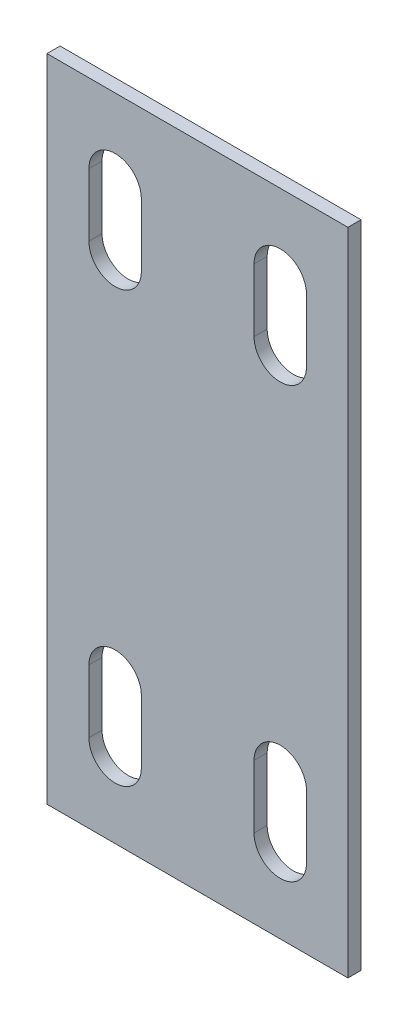
ISO-10303-21;
HEADER;
FILE_DESCRIPTION(('STEP AP214'),'2;1');
FILE_NAME('part.step','',(''),(''),'','','');
FILE_SCHEMA(('AUTOMOTIVE_DESIGN { 1 0 10303 214 1 1 1 1 }'));
ENDSEC;
DATA;
#1=APPLICATION_CONTEXT('core data for automotive mechanical design processes');
#2=APPLICATION_PROTOCOL_DEFINITION('international standard','automotive_design',2000,#1);
#3=PRODUCT_CONTEXT('',#1,'mechanical');
#4=PRODUCT('Part','Part','',(#3));
#5=PRODUCT_RELATED_PRODUCT_CATEGORY('part','',(#4));
#6=PRODUCT_DEFINITION_FORMATION('','',#4);
#7=PRODUCT_DEFINITION_CONTEXT('part definition',#1,'design');
#8=PRODUCT_DEFINITION('design','',#6,#7);
#9=PRODUCT_DEFINITION_SHAPE('','',#8);
#10=(LENGTH_UNIT() NAMED_UNIT(*) SI_UNIT(.MILLI.,.METRE.));
#11=(NAMED_UNIT(*) PLANE_ANGLE_UNIT() SI_UNIT($,.RADIAN.));
#12=(NAMED_UNIT(*) SI_UNIT($,.STERADIAN.) SOLID_ANGLE_UNIT());
#13=UNCERTAINTY_MEASURE_WITH_UNIT(LENGTH_MEASURE(1.E-05),#10,'distance_accuracy_value','');
#14=(GEOMETRIC_REPRESENTATION_CONTEXT(3) GLOBAL_UNCERTAINTY_ASSIGNED_CONTEXT((#13)) GLOBAL_UNIT_ASSIGNED_CONTEXT((#10,
#11,#12)) REPRESENTATION_CONTEXT('',''));
#15=CARTESIAN_POINT('',(0.,0.,0.));
#16=DIRECTION('',(0.,0.,1.));
#17=DIRECTION('',(1.,0.,0.));
#18=AXIS2_PLACEMENT_3D('',#15,#16,#17);
#19=CARTESIAN_POINT('',(-101.381085315594,81.3749480536358,3.175));
#20=DIRECTION('',(1.,0.,0.));
#21=DIRECTION('',(0.,1.,0.));
#22=AXIS2_PLACEMENT_3D('',#19,#20,#21);
#23=PLANE('',#22);
#24=DIRECTION('',(0.,-1.,0.));
#25=VECTOR('',#24,1.);
#26=CARTESIAN_POINT('',(-101.381085315594,81.3749480536358,0.));
#27=LINE('',#26,#25);
#28=CARTESIAN_POINT('',(-101.381085315594,81.3749480536358,0.));
#29=VERTEX_POINT('',#28);
#30=CARTESIAN_POINT('',(-101.381085315594,-76.1050519463642,0.));
#31=VERTEX_POINT('',#30);
#32=EDGE_CURVE('E350',#29,#31,#27,.T.);
#33=ORIENTED_EDGE('',*,*,#32,.T.);
#34=DIRECTION('',(0.,0.,-1.));
#35=VECTOR('',#34,1.);
#36=CARTESIAN_POINT('',(-101.381085315594,-76.1050519463642,3.175));
#37=LINE('',#36,#35);
#38=CARTESIAN_POINT('',(-101.381085315594,-76.1050519463642,3.175));
#39=VERTEX_POINT('',#38);
#40=EDGE_CURVE('E11',#39,#31,#37,.T.);
#41=ORIENTED_EDGE('',*,*,#40,.F.);
#42=DIRECTION('',(0.,-1.,0.));
#43=VECTOR('',#42,1.);
#44=CARTESIAN_POINT('',(-101.381085315594,81.3749480536358,3.175));
#45=LINE('',#44,#43);
#46=CARTESIAN_POINT('',(-101.381085315594,81.3749480536358,3.175));
#47=VERTEX_POINT('',#46);
#48=EDGE_CURVE('E360',#47,#39,#45,.T.);
#49=ORIENTED_EDGE('',*,*,#48,.F.);
#50=DIRECTION('',(0.,0.,-1.));
#51=VECTOR('',#50,1.);
#52=CARTESIAN_POINT('',(-101.381085315594,81.3749480536358,3.175));
#53=LINE('',#52,#51);
#54=EDGE_CURVE('E374',#47,#29,#53,.T.);
#55=ORIENTED_EDGE('',*,*,#54,.T.);
#56=EDGE_LOOP('',(#33,#41,#49,#55));
#57=FACE_BOUND('',#56,.T.);
#58=ADVANCED_FACE('F39',(#57),#23,.F.);
#59=CARTESIAN_POINT('',(-101.381085315594,-76.1050519463642,3.175));
#60=DIRECTION('',(0.,1.,0.));
#61=DIRECTION('',(0.,0.,1.));
#62=AXIS2_PLACEMENT_3D('',#59,#60,#61);
#63=PLANE('',#62);
#64=DIRECTION('',(1.,0.,0.));
#65=VECTOR('',#64,1.);
#66=CARTESIAN_POINT('',(-101.381085315594,-76.1050519463642,0.));
#67=LINE('',#66,#65);
#68=CARTESIAN_POINT('',(-28.4830853155941,-76.1050519463642,0.));
#69=VERTEX_POINT('',#68);
#70=EDGE_CURVE('E378',#31,#69,#67,.T.);
#71=ORIENTED_EDGE('',*,*,#70,.T.);
#72=DIRECTION('',(0.,0.,-1.));
#73=VECTOR('',#72,1.);
#74=CARTESIAN_POINT('',(-28.4830853155941,-76.1050519463642,3.175));
#75=LINE('',#74,#73);
#76=CARTESIAN_POINT('',(-28.4830853155941,-76.1050519463642,3.175));
#77=VERTEX_POINT('',#76);
#78=EDGE_CURVE('E47',#77,#69,#75,.T.);
#79=ORIENTED_EDGE('',*,*,#78,.F.);
#80=DIRECTION('',(1.,0.,0.));
#81=VECTOR('',#80,1.);
#82=CARTESIAN_POINT('',(-101.381085315594,-76.1050519463642,3.175));
#83=LINE('',#82,#81);
#84=EDGE_CURVE('E364',#39,#77,#83,.T.);
#85=ORIENTED_EDGE('',*,*,#84,.F.);
#86=ORIENTED_EDGE('',*,*,#40,.T.);
#87=EDGE_LOOP('',(#71,#79,#85,#86));
#88=FACE_BOUND('',#87,.T.);
#89=ADVANCED_FACE('F413',(#88),#63,.F.);
#90=CARTESIAN_POINT('',(-28.4830853155941,81.3749480536358,3.175));
#91=DIRECTION('',(-1.,0.,0.));
#92=DIRECTION('',(0.,-1.,0.));
#93=AXIS2_PLACEMENT_3D('',#90,#91,#92);
#94=PLANE('',#93);
#95=DIRECTION('',(0.,1.,0.));
#96=VECTOR('',#95,1.);
#97=CARTESIAN_POINT('',(-28.4830853155941,81.3749480536358,0.));
#98=LINE('',#97,#96);
#99=CARTESIAN_POINT('',(-28.4830853155941,81.3749480536358,0.));
#100=VERTEX_POINT('',#99);
#101=EDGE_CURVE('E381',#69,#100,#98,.T.);
#102=ORIENTED_EDGE('',*,*,#101,.T.);
#103=DIRECTION('',(0.,0.,-1.));
#104=VECTOR('',#103,1.);
#105=CARTESIAN_POINT('',(-28.4830853155941,81.3749480536358,3.175));
#106=LINE('',#105,#104);
#107=CARTESIAN_POINT('',(-28.4830853155941,81.3749480536358,3.175));
#108=VERTEX_POINT('',#107);
#109=EDGE_CURVE('E389',#108,#100,#106,.T.);
#110=ORIENTED_EDGE('',*,*,#109,.F.);
#111=DIRECTION('',(0.,1.,0.));
#112=VECTOR('',#111,1.);
#113=CARTESIAN_POINT('',(-28.4830853155941,81.3749480536358,3.175));
#114=LINE('',#113,#112);
#115=EDGE_CURVE('E368',#77,#108,#114,.T.);
#116=ORIENTED_EDGE('',*,*,#115,.F.);
#117=ORIENTED_EDGE('',*,*,#78,.T.);
#118=EDGE_LOOP('',(#102,#110,#116,#117));
#119=FACE_BOUND('',#118,.T.);
#120=ADVANCED_FACE('F398',(#119),#94,.F.);
#121=CARTESIAN_POINT('',(-101.381085315594,81.3749480536358,3.175));
#122=DIRECTION('',(0.,-1.,0.));
#123=DIRECTION('',(0.,0.,-1.));
#124=AXIS2_PLACEMENT_3D('',#121,#122,#123);
#125=PLANE('',#124);
#126=DIRECTION('',(-1.,0.,0.));
#127=VECTOR('',#126,1.);
#128=CARTESIAN_POINT('',(-101.381085315594,81.3749480536358,0.));
#129=LINE('',#128,#127);
#130=EDGE_CURVE('E365',#100,#29,#129,.T.);
#131=ORIENTED_EDGE('',*,*,#130,.T.);
#132=ORIENTED_EDGE('',*,*,#54,.F.);
#133=DIRECTION('',(-1.,0.,0.));
#134=VECTOR('',#133,1.);
#135=CARTESIAN_POINT('',(-101.381085315594,81.3749480536358,3.175));
#136=LINE('',#135,#134);
#137=EDGE_CURVE('E371',#108,#47,#136,.T.);
#138=ORIENTED_EDGE('',*,*,#137,.F.);
#139=ORIENTED_EDGE('',*,*,#109,.T.);
#140=EDGE_LOOP('',(#131,#132,#138,#139));
#141=FACE_BOUND('',#140,.T.);
#142=ADVANCED_FACE('F406',(#141),#125,.F.);
#143=CARTESIAN_POINT('',(0.,0.,3.175));
#144=DIRECTION('',(0.,0.,1.));
#145=DIRECTION('',(1.,0.,0.));
#146=AXIS2_PLACEMENT_3D('',#143,#144,#145);
#147=PLANE('',#146);
#148=CARTESIAN_POINT('',(-44.8711656839901,62.3249484220318,3.175));
#149=DIRECTION('',(0.,0.,1.));
#150=DIRECTION('',(1.,0.,0.));
#151=AXIS2_PLACEMENT_3D('',#148,#149,#150);
#152=CIRCLE('',#151,6.349999631604);
#153=CARTESIAN_POINT('',(-38.5211660523861,62.3249484220318,3.175));
#154=VERTEX_POINT('',#153);
#155=CARTESIAN_POINT('',(-51.2211653155941,62.3249484220318,3.175));
#156=VERTEX_POINT('',#155);
#157=EDGE_CURVE('E54',#154,#156,#152,.T.);
#158=ORIENTED_EDGE('',*,*,#157,.F.);
#159=DIRECTION('',(0.,1.,0.));
#160=VECTOR('',#159,1.);
#161=CARTESIAN_POINT('',(-38.5211660523861,62.3249484220318,3.175));
#162=LINE('',#161,#160);
#163=CARTESIAN_POINT('',(-38.5211660523861,47.0849480536358,3.175));
#164=VERTEX_POINT('',#163);
#165=EDGE_CURVE('E280',#164,#154,#162,.T.);
#166=ORIENTED_EDGE('',*,*,#165,.F.);
#167=CARTESIAN_POINT('',(-44.8711656839901,47.0849480536358,3.175));
#168=DIRECTION('',(0.,0.,1.));
#169=DIRECTION('',(1.,0.,0.));
#170=AXIS2_PLACEMENT_3D('',#167,#168,#169);
#171=CIRCLE('',#170,6.349999631604);
#172=CARTESIAN_POINT('',(-51.2211653155941,47.0849480536358,3.175));
#173=VERTEX_POINT('',#172);
#174=EDGE_CURVE('E299',#173,#164,#171,.T.);
#175=ORIENTED_EDGE('',*,*,#174,.F.);
#176=DIRECTION('',(0.,-1.,0.));
#177=VECTOR('',#176,1.);
#178=CARTESIAN_POINT('',(-51.2211653155941,62.3249484220318,3.175));
#179=LINE('',#178,#177);
#180=EDGE_CURVE('E295',#156,#173,#179,.T.);
#181=ORIENTED_EDGE('',*,*,#180,.F.);
#182=EDGE_LOOP('',(#158,#166,#175,#181));
#183=FACE_BOUND('',#182,.T.);
#184=CARTESIAN_POINT('',(-84.8710856839901,-41.8150512095722,3.175));
#185=DIRECTION('',(0.,0.,1.));
#186=DIRECTION('',(1.,0.,0.));
#187=AXIS2_PLACEMENT_3D('',#184,#185,#186);
#188=CIRCLE('',#187,6.349999631604);
#189=CARTESIAN_POINT('',(-78.5210860523861,-41.8150512095722,3.175));
#190=VERTEX_POINT('',#189);
#191=CARTESIAN_POINT('',(-91.2210853155941,-41.8150512095722,3.175));
#192=VERTEX_POINT('',#191);
#193=EDGE_CURVE('E62',#190,#192,#188,.T.);
#194=ORIENTED_EDGE('',*,*,#193,.F.);
#195=DIRECTION('',(0.,1.,0.));
#196=VECTOR('',#195,1.);
#197=CARTESIAN_POINT('',(-78.5210860523861,-41.8150512095722,3.175));
#198=LINE('',#197,#196);
#199=CARTESIAN_POINT('',(-78.5210860523861,-57.0550515779682,3.175));
#200=VERTEX_POINT('',#199);
#201=EDGE_CURVE('E238',#200,#190,#198,.T.);
#202=ORIENTED_EDGE('',*,*,#201,.F.);
#203=CARTESIAN_POINT('',(-84.8710856839901,-57.0550515779682,3.175));
#204=DIRECTION('',(0.,0.,1.));
#205=DIRECTION('',(1.,0.,0.));
#206=AXIS2_PLACEMENT_3D('',#203,#204,#205);
#207=CIRCLE('',#206,6.349999631604);
#208=CARTESIAN_POINT('',(-91.2210853155941,-57.0550515779682,3.175));
#209=VERTEX_POINT('',#208);
#210=EDGE_CURVE('E258',#209,#200,#207,.T.);
#211=ORIENTED_EDGE('',*,*,#210,.F.);
#212=DIRECTION('',(0.,-1.,0.));
#213=VECTOR('',#212,1.);
#214=CARTESIAN_POINT('',(-91.2210853155941,-41.8150512095722,3.175));
#215=LINE('',#214,#213);
#216=EDGE_CURVE('E253',#192,#209,#215,.T.);
#217=ORIENTED_EDGE('',*,*,#216,.F.);
#218=EDGE_LOOP('',(#194,#202,#211,#217));
#219=FACE_BOUND('',#218,.T.);
#220=CARTESIAN_POINT('',(-44.8711656839901,-57.0550515779682,3.175));
#221=DIRECTION('',(0.,0.,1.));
#222=DIRECTION('',(1.,0.,0.));
#223=AXIS2_PLACEMENT_3D('',#220,#221,#222);
#224=CIRCLE('',#223,6.34999963160401);
#225=CARTESIAN_POINT('',(-51.2211653155941,-57.0550515779682,3.175));
#226=VERTEX_POINT('',#225);
#227=CARTESIAN_POINT('',(-38.5211660523861,-57.0550515779682,3.175));
#228=VERTEX_POINT('',#227);
#229=EDGE_CURVE('E183',#226,#228,#224,.T.);
#230=ORIENTED_EDGE('',*,*,#229,.F.);
#231=DIRECTION('',(0.,-1.,0.));
#232=VECTOR('',#231,1.);
#233=CARTESIAN_POINT('',(-51.2211653155941,-57.0550515779682,3.175));
#234=LINE('',#233,#232);
#235=CARTESIAN_POINT('',(-51.2211653155941,-41.8150512095722,3.175));
#236=VERTEX_POINT('',#235);
#237=EDGE_CURVE('E204',#236,#226,#234,.T.);
#238=ORIENTED_EDGE('',*,*,#237,.F.);
#239=CARTESIAN_POINT('',(-44.8711656839901,-41.8150512095722,3.175));
#240=DIRECTION('',(0.,0.,1.));
#241=DIRECTION('',(1.,0.,0.));
#242=AXIS2_PLACEMENT_3D('',#239,#240,#241);
#243=CIRCLE('',#242,6.34999963160399);
#244=CARTESIAN_POINT('',(-38.5211660523861,-41.8150512095722,3.175));
#245=VERTEX_POINT('',#244);
#246=EDGE_CURVE('E208',#245,#236,#243,.T.);
#247=ORIENTED_EDGE('',*,*,#246,.F.);
#248=DIRECTION('',(0.,1.,0.));
#249=VECTOR('',#248,1.);
#250=CARTESIAN_POINT('',(-38.5211660523861,-57.0550515779682,3.175));
#251=LINE('',#250,#249);
#252=EDGE_CURVE('E217',#228,#245,#251,.T.);
#253=ORIENTED_EDGE('',*,*,#252,.F.);
#254=EDGE_LOOP('',(#230,#238,#247,#253));
#255=FACE_BOUND('',#254,.T.);
#256=CARTESIAN_POINT('',(-84.8710856839901,47.0849480536358,3.175));
#257=DIRECTION('',(0.,0.,1.));
#258=DIRECTION('',(1.,0.,0.));
#259=AXIS2_PLACEMENT_3D('',#256,#257,#258);
#260=CIRCLE('',#259,6.349999631604);
#261=CARTESIAN_POINT('',(-91.2210853155941,47.0849480536358,3.175));
#262=VERTEX_POINT('',#261);
#263=CARTESIAN_POINT('',(-78.5210860523861,47.0849480536358,3.175));
#264=VERTEX_POINT('',#263);
#265=EDGE_CURVE('E227',#262,#264,#260,.T.);
#266=ORIENTED_EDGE('',*,*,#265,.F.);
#267=DIRECTION('',(0.,-1.,0.));
#268=VECTOR('',#267,1.);
#269=CARTESIAN_POINT('',(-91.2210853155941,47.0849480536358,3.175));
#270=LINE('',#269,#268);
#271=CARTESIAN_POINT('',(-91.2210853155941,62.3249484220318,3.175));
#272=VERTEX_POINT('',#271);
#273=EDGE_CURVE('E321',#272,#262,#270,.T.);
#274=ORIENTED_EDGE('',*,*,#273,.F.);
#275=CARTESIAN_POINT('',(-84.8710856839901,62.3249484220318,3.175));
#276=DIRECTION('',(0.,0.,1.));
#277=DIRECTION('',(1.,0.,0.));
#278=AXIS2_PLACEMENT_3D('',#275,#276,#277);
#279=CIRCLE('',#278,6.349999631604);
#280=CARTESIAN_POINT('',(-78.5210860523861,62.3249484220318,3.175));
#281=VERTEX_POINT('',#280);
#282=EDGE_CURVE('E340',#281,#272,#279,.T.);
#283=ORIENTED_EDGE('',*,*,#282,.F.);
#284=DIRECTION('',(0.,1.,0.));
#285=VECTOR('',#284,1.);
#286=CARTESIAN_POINT('',(-78.5210860523861,47.0849480536358,3.175));
#287=LINE('',#286,#285);
#288=EDGE_CURVE('E336',#264,#281,#287,.T.);
#289=ORIENTED_EDGE('',*,*,#288,.F.);
#290=EDGE_LOOP('',(#266,#274,#283,#289));
#291=FACE_BOUND('',#290,.T.);
#292=ORIENTED_EDGE('',*,*,#48,.T.);
#293=ORIENTED_EDGE('',*,*,#84,.T.);
#294=ORIENTED_EDGE('',*,*,#115,.T.);
#295=ORIENTED_EDGE('',*,*,#137,.T.);
#296=EDGE_LOOP('',(#292,#293,#294,#295));
#297=FACE_BOUND('',#296,.T.);
#298=ADVANCED_FACE('F412',(#183,#219,#255,#291,#297),#147,.T.);
#299=CARTESIAN_POINT('',(0.,0.,0.));
#300=DIRECTION('',(0.,0.,1.));
#301=DIRECTION('',(1.,0.,0.));
#302=AXIS2_PLACEMENT_3D('',#299,#300,#301);
#303=PLANE('',#302);
#304=DIRECTION('',(0.,1.,0.));
#305=VECTOR('',#304,1.);
#306=CARTESIAN_POINT('',(-38.5211660523861,62.3249484220318,0.));
#307=LINE('',#306,#305);
#308=CARTESIAN_POINT('',(-38.5211660523861,47.0849480536358,0.));
#309=VERTEX_POINT('',#308);
#310=CARTESIAN_POINT('',(-38.5211660523861,62.3249484220318,0.));
#311=VERTEX_POINT('',#310);
#312=EDGE_CURVE('E288',#309,#311,#307,.T.);
#313=ORIENTED_EDGE('',*,*,#312,.T.);
#314=CARTESIAN_POINT('',(-44.8711656839901,62.3249484220318,0.));
#315=DIRECTION('',(0.,0.,1.));
#316=DIRECTION('',(1.,0.,0.));
#317=AXIS2_PLACEMENT_3D('',#314,#315,#316);
#318=CIRCLE('',#317,6.349999631604);
#319=CARTESIAN_POINT('',(-51.2211653155941,62.3249484220318,0.));
#320=VERTEX_POINT('',#319);
#321=EDGE_CURVE('E275',#311,#320,#318,.T.);
#322=ORIENTED_EDGE('',*,*,#321,.T.);
#323=DIRECTION('',(0.,-1.,0.));
#324=VECTOR('',#323,1.);
#325=CARTESIAN_POINT('',(-51.2211653155941,62.3249484220318,0.));
#326=LINE('',#325,#324);
#327=CARTESIAN_POINT('',(-51.2211653155941,47.0849480536358,0.));
#328=VERTEX_POINT('',#327);
#329=EDGE_CURVE('E279',#320,#328,#326,.T.);
#330=ORIENTED_EDGE('',*,*,#329,.T.);
#331=CARTESIAN_POINT('',(-44.8711656839901,47.0849480536358,0.));
#332=DIRECTION('',(0.,0.,1.));
#333=DIRECTION('',(1.,0.,0.));
#334=AXIS2_PLACEMENT_3D('',#331,#332,#333);
#335=CIRCLE('',#334,6.349999631604);
#336=EDGE_CURVE('E284',#328,#309,#335,.T.);
#337=ORIENTED_EDGE('',*,*,#336,.T.);
#338=EDGE_LOOP('',(#313,#322,#330,#337));
#339=FACE_BOUND('',#338,.T.);
#340=DIRECTION('',(0.,1.,0.));
#341=VECTOR('',#340,1.);
#342=CARTESIAN_POINT('',(-78.5210860523861,-41.8150512095722,0.));
#343=LINE('',#342,#341);
#344=CARTESIAN_POINT('',(-78.5210860523861,-57.0550515779682,0.));
#345=VERTEX_POINT('',#344);
#346=CARTESIAN_POINT('',(-78.5210860523861,-41.8150512095722,0.));
#347=VERTEX_POINT('',#346);
#348=EDGE_CURVE('E246',#345,#347,#343,.T.);
#349=ORIENTED_EDGE('',*,*,#348,.T.);
#350=CARTESIAN_POINT('',(-84.8710856839901,-41.8150512095722,0.));
#351=DIRECTION('',(0.,0.,1.));
#352=DIRECTION('',(1.,0.,0.));
#353=AXIS2_PLACEMENT_3D('',#350,#351,#352);
#354=CIRCLE('',#353,6.349999631604);
#355=CARTESIAN_POINT('',(-91.2210853155941,-41.8150512095722,0.));
#356=VERTEX_POINT('',#355);
#357=EDGE_CURVE('E233',#347,#356,#354,.T.);
#358=ORIENTED_EDGE('',*,*,#357,.T.);
#359=DIRECTION('',(0.,-1.,0.));
#360=VECTOR('',#359,1.);
#361=CARTESIAN_POINT('',(-91.2210853155941,-41.8150512095722,0.));
#362=LINE('',#361,#360);
#363=CARTESIAN_POINT('',(-91.2210853155941,-57.0550515779682,0.));
#364=VERTEX_POINT('',#363);
#365=EDGE_CURVE('E237',#356,#364,#362,.T.);
#366=ORIENTED_EDGE('',*,*,#365,.T.);
#367=CARTESIAN_POINT('',(-84.8710856839901,-57.0550515779682,0.));
#368=DIRECTION('',(0.,0.,1.));
#369=DIRECTION('',(1.,0.,0.));
#370=AXIS2_PLACEMENT_3D('',#367,#368,#369);
#371=CIRCLE('',#370,6.349999631604);
#372=EDGE_CURVE('E242',#364,#345,#371,.T.);
#373=ORIENTED_EDGE('',*,*,#372,.T.);
#374=EDGE_LOOP('',(#349,#358,#366,#373));
#375=FACE_BOUND('',#374,.T.);
#376=DIRECTION('',(0.,-1.,0.));
#377=VECTOR('',#376,1.);
#378=CARTESIAN_POINT('',(-51.2211653155941,-57.0550515779682,0.));
#379=LINE('',#378,#377);
#380=CARTESIAN_POINT('',(-51.2211653155941,-41.8150512095722,0.));
#381=VERTEX_POINT('',#380);
#382=CARTESIAN_POINT('',(-51.2211653155941,-57.0550515779682,0.));
#383=VERTEX_POINT('',#382);
#384=EDGE_CURVE('E189',#381,#383,#379,.T.);
#385=ORIENTED_EDGE('',*,*,#384,.T.);
#386=CARTESIAN_POINT('',(-44.8711656839901,-57.0550515779682,0.));
#387=DIRECTION('',(0.,0.,1.));
#388=DIRECTION('',(1.,0.,0.));
#389=AXIS2_PLACEMENT_3D('',#386,#387,#388);
#390=CIRCLE('',#389,6.34999963160401);
#391=CARTESIAN_POINT('',(-38.5211660523861,-57.0550515779682,0.));
#392=VERTEX_POINT('',#391);
#393=EDGE_CURVE('E180',#383,#392,#390,.T.);
#394=ORIENTED_EDGE('',*,*,#393,.T.);
#395=DIRECTION('',(0.,1.,0.));
#396=VECTOR('',#395,1.);
#397=CARTESIAN_POINT('',(-38.5211660523861,-57.0550515779682,0.));
#398=LINE('',#397,#396);
#399=CARTESIAN_POINT('',(-38.5211660523861,-41.8150512095722,0.));
#400=VERTEX_POINT('',#399);
#401=EDGE_CURVE('E193',#392,#400,#398,.T.);
#402=ORIENTED_EDGE('',*,*,#401,.T.);
#403=CARTESIAN_POINT('',(-44.8711656839901,-41.8150512095722,0.));
#404=DIRECTION('',(0.,0.,1.));
#405=DIRECTION('',(1.,0.,0.));
#406=AXIS2_PLACEMENT_3D('',#403,#404,#405);
#407=CIRCLE('',#406,6.34999963160399);
#408=EDGE_CURVE('E198',#400,#381,#407,.T.);
#409=ORIENTED_EDGE('',*,*,#408,.T.);
#410=EDGE_LOOP('',(#385,#394,#402,#409));
#411=FACE_BOUND('',#410,.T.);
#412=DIRECTION('',(0.,-1.,0.));
#413=VECTOR('',#412,1.);
#414=CARTESIAN_POINT('',(-91.2210853155941,47.0849480536358,0.));
#415=LINE('',#414,#413);
#416=CARTESIAN_POINT('',(-91.2210853155941,62.3249484220318,0.));
#417=VERTEX_POINT('',#416);
#418=CARTESIAN_POINT('',(-91.2210853155941,47.0849480536358,0.));
#419=VERTEX_POINT('',#418);
#420=EDGE_CURVE('E329',#417,#419,#415,.T.);
#421=ORIENTED_EDGE('',*,*,#420,.T.);
#422=CARTESIAN_POINT('',(-84.8710856839901,47.0849480536358,0.));
#423=DIRECTION('',(0.,0.,1.));
#424=DIRECTION('',(1.,0.,0.));
#425=AXIS2_PLACEMENT_3D('',#422,#423,#424);
#426=CIRCLE('',#425,6.349999631604);
#427=CARTESIAN_POINT('',(-78.5210860523861,47.0849480536358,0.));
#428=VERTEX_POINT('',#427);
#429=EDGE_CURVE('E316',#419,#428,#426,.T.);
#430=ORIENTED_EDGE('',*,*,#429,.T.);
#431=DIRECTION('',(0.,1.,0.));
#432=VECTOR('',#431,1.);
#433=CARTESIAN_POINT('',(-78.5210860523861,47.0849480536358,0.));
#434=LINE('',#433,#432);
#435=CARTESIAN_POINT('',(-78.5210860523861,62.3249484220318,0.));
#436=VERTEX_POINT('',#435);
#437=EDGE_CURVE('E320',#428,#436,#434,.T.);
#438=ORIENTED_EDGE('',*,*,#437,.T.);
#439=CARTESIAN_POINT('',(-84.8710856839901,62.3249484220318,0.));
#440=DIRECTION('',(0.,0.,1.));
#441=DIRECTION('',(1.,0.,0.));
#442=AXIS2_PLACEMENT_3D('',#439,#440,#441);
#443=CIRCLE('',#442,6.349999631604);
#444=EDGE_CURVE('E325',#436,#417,#443,.T.);
#445=ORIENTED_EDGE('',*,*,#444,.T.);
#446=EDGE_LOOP('',(#421,#430,#438,#445));
#447=FACE_BOUND('',#446,.T.);
#448=ORIENTED_EDGE('',*,*,#32,.F.);
#449=ORIENTED_EDGE('',*,*,#130,.F.);
#450=ORIENTED_EDGE('',*,*,#101,.F.);
#451=ORIENTED_EDGE('',*,*,#70,.F.);
#452=EDGE_LOOP('',(#448,#449,#450,#451));
#453=FACE_BOUND('',#452,.T.);
#454=ADVANCED_FACE('F200',(#339,#375,#411,#447,#453),#303,.F.);
#455=CARTESIAN_POINT('',(-84.8710856839901,47.0849480536358,0.));
#456=DIRECTION('',(0.,0.,1.));
#457=DIRECTION('',(1.,0.,0.));
#458=AXIS2_PLACEMENT_3D('',#455,#456,#457);
#459=CYLINDRICAL_SURFACE('',#458,6.349999631604);
#460=ORIENTED_EDGE('',*,*,#265,.T.);
#461=DIRECTION('',(0.,0.,1.));
#462=VECTOR('',#461,1.);
#463=CARTESIAN_POINT('',(-78.5210860523861,47.0849480536358,0.));
#464=LINE('',#463,#462);
#465=EDGE_CURVE('E333',#428,#264,#464,.T.);
#466=ORIENTED_EDGE('',*,*,#465,.F.);
#467=ORIENTED_EDGE('',*,*,#429,.F.);
#468=DIRECTION('',(0.,0.,1.));
#469=VECTOR('',#468,1.);
#470=CARTESIAN_POINT('',(-91.2210853155941,47.0849480536358,0.));
#471=LINE('',#470,#469);
#472=EDGE_CURVE('E347',#419,#262,#471,.T.);
#473=ORIENTED_EDGE('',*,*,#472,.T.);
#474=EDGE_LOOP('',(#460,#466,#467,#473));
#475=FACE_BOUND('',#474,.T.);
#476=ADVANCED_FACE('F425',(#475),#459,.F.);
#477=CARTESIAN_POINT('',(-91.2210853155941,47.0849480536358,0.));
#478=DIRECTION('',(-1.,0.,0.));
#479=DIRECTION('',(0.,0.,1.));
#480=AXIS2_PLACEMENT_3D('',#477,#478,#479);
#481=PLANE('',#480);
#482=ORIENTED_EDGE('',*,*,#273,.T.);
#483=ORIENTED_EDGE('',*,*,#472,.F.);
#484=ORIENTED_EDGE('',*,*,#420,.F.);
#485=DIRECTION('',(0.,0.,1.));
#486=VECTOR('',#485,1.);
#487=CARTESIAN_POINT('',(-91.2210853155941,62.3249484220318,0.));
#488=LINE('',#487,#486);
#489=EDGE_CURVE('E351',#417,#272,#488,.T.);
#490=ORIENTED_EDGE('',*,*,#489,.T.);
#491=EDGE_LOOP('',(#482,#483,#484,#490));
#492=FACE_BOUND('',#491,.T.);
#493=ADVANCED_FACE('F432',(#492),#481,.F.);
#494=CARTESIAN_POINT('',(-84.8710856839901,62.3249484220318,0.));
#495=DIRECTION('',(0.,0.,1.));
#496=DIRECTION('',(1.,0.,0.));
#497=AXIS2_PLACEMENT_3D('',#494,#495,#496);
#498=CYLINDRICAL_SURFACE('',#497,6.349999631604);
#499=ORIENTED_EDGE('',*,*,#282,.T.);
#500=ORIENTED_EDGE('',*,*,#489,.F.);
#501=ORIENTED_EDGE('',*,*,#444,.F.);
#502=DIRECTION('',(0.,0.,1.));
#503=VECTOR('',#502,1.);
#504=CARTESIAN_POINT('',(-78.5210860523861,62.3249484220318,0.));
#505=LINE('',#504,#503);
#506=EDGE_CURVE('E354',#436,#281,#505,.T.);
#507=ORIENTED_EDGE('',*,*,#506,.T.);
#508=EDGE_LOOP('',(#499,#500,#501,#507));
#509=FACE_BOUND('',#508,.T.);
#510=ADVANCED_FACE('F437',(#509),#498,.F.);
#511=CARTESIAN_POINT('',(-78.5210860523861,47.0849480536358,0.));
#512=DIRECTION('',(1.,0.,0.));
#513=DIRECTION('',(0.,0.,-1.));
#514=AXIS2_PLACEMENT_3D('',#511,#512,#513);
#515=PLANE('',#514);
#516=ORIENTED_EDGE('',*,*,#288,.T.);
#517=ORIENTED_EDGE('',*,*,#506,.F.);
#518=ORIENTED_EDGE('',*,*,#437,.F.);
#519=ORIENTED_EDGE('',*,*,#465,.T.);
#520=EDGE_LOOP('',(#516,#517,#518,#519));
#521=FACE_BOUND('',#520,.T.);
#522=ADVANCED_FACE('F434',(#521),#515,.F.);
#523=CARTESIAN_POINT('',(-44.8711656839901,-57.0550515779682,0.));
#524=DIRECTION('',(0.,0.,1.));
#525=DIRECTION('',(1.,0.,0.));
#526=AXIS2_PLACEMENT_3D('',#523,#524,#525);
#527=CYLINDRICAL_SURFACE('',#526,6.34999963160401);
#528=ORIENTED_EDGE('',*,*,#229,.T.);
#529=DIRECTION('',(0.,0.,1.));
#530=VECTOR('',#529,1.);
#531=CARTESIAN_POINT('',(-38.5211660523861,-57.0550515779682,0.));
#532=LINE('',#531,#530);
#533=EDGE_CURVE('E176',#392,#228,#532,.T.);
#534=ORIENTED_EDGE('',*,*,#533,.F.);
#535=ORIENTED_EDGE('',*,*,#393,.F.);
#536=DIRECTION('',(0.,0.,1.));
#537=VECTOR('',#536,1.);
#538=CARTESIAN_POINT('',(-51.2211653155941,-57.0550515779682,0.));
#539=LINE('',#538,#537);
#540=EDGE_CURVE('E224',#383,#226,#539,.T.);
#541=ORIENTED_EDGE('',*,*,#540,.T.);
#542=EDGE_LOOP('',(#528,#534,#535,#541));
#543=FACE_BOUND('',#542,.T.);
#544=ADVANCED_FACE('F178',(#543),#527,.F.);
#545=CARTESIAN_POINT('',(-51.2211653155941,-57.0550515779682,0.));
#546=DIRECTION('',(-1.,0.,0.));
#547=DIRECTION('',(0.,-1.,0.));
#548=AXIS2_PLACEMENT_3D('',#545,#546,#547);
#549=PLANE('',#548);
#550=ORIENTED_EDGE('',*,*,#237,.T.);
#551=ORIENTED_EDGE('',*,*,#540,.F.);
#552=ORIENTED_EDGE('',*,*,#384,.F.);
#553=DIRECTION('',(0.,0.,1.));
#554=VECTOR('',#553,1.);
#555=CARTESIAN_POINT('',(-51.2211653155941,-41.8150512095722,0.));
#556=LINE('',#555,#554);
#557=EDGE_CURVE('E228',#381,#236,#556,.T.);
#558=ORIENTED_EDGE('',*,*,#557,.T.);
#559=EDGE_LOOP('',(#550,#551,#552,#558));
#560=FACE_BOUND('',#559,.T.);
#561=ADVANCED_FACE('F477',(#560),#549,.F.);
#562=CARTESIAN_POINT('',(-44.8711656839901,-41.8150512095722,0.));
#563=DIRECTION('',(0.,0.,1.));
#564=DIRECTION('',(1.,0.,0.));
#565=AXIS2_PLACEMENT_3D('',#562,#563,#564);
#566=CYLINDRICAL_SURFACE('',#565,6.34999963160399);
#567=ORIENTED_EDGE('',*,*,#246,.T.);
#568=ORIENTED_EDGE('',*,*,#557,.F.);
#569=ORIENTED_EDGE('',*,*,#408,.F.);
#570=DIRECTION('',(0.,0.,1.));
#571=VECTOR('',#570,1.);
#572=CARTESIAN_POINT('',(-38.5211660523861,-41.8150512095722,0.));
#573=LINE('',#572,#571);
#574=EDGE_CURVE('E188',#400,#245,#573,.T.);
#575=ORIENTED_EDGE('',*,*,#574,.T.);
#576=EDGE_LOOP('',(#567,#568,#569,#575));
#577=FACE_BOUND('',#576,.T.);
#578=ADVANCED_FACE('F480',(#577),#566,.F.);
#579=CARTESIAN_POINT('',(-38.5211660523861,-57.0550515779682,0.));
#580=DIRECTION('',(1.,0.,0.));
#581=DIRECTION('',(0.,1.,0.));
#582=AXIS2_PLACEMENT_3D('',#579,#580,#581);
#583=PLANE('',#582);
#584=ORIENTED_EDGE('',*,*,#252,.T.);
#585=ORIENTED_EDGE('',*,*,#574,.F.);
#586=ORIENTED_EDGE('',*,*,#401,.F.);
#587=ORIENTED_EDGE('',*,*,#533,.T.);
#588=EDGE_LOOP('',(#584,#585,#586,#587));
#589=FACE_BOUND('',#588,.T.);
#590=ADVANCED_FACE('F194',(#589),#583,.F.);
#591=CARTESIAN_POINT('',(-84.8710856839901,-41.8150512095722,0.));
#592=DIRECTION('',(0.,0.,1.));
#593=DIRECTION('',(1.,0.,0.));
#594=AXIS2_PLACEMENT_3D('',#591,#592,#593);
#595=CYLINDRICAL_SURFACE('',#594,6.349999631604);
#596=ORIENTED_EDGE('',*,*,#193,.T.);
#597=DIRECTION('',(0.,0.,1.));
#598=VECTOR('',#597,1.);
#599=CARTESIAN_POINT('',(-91.2210853155941,-41.8150512095722,0.));
#600=LINE('',#599,#598);
#601=EDGE_CURVE('E250',#356,#192,#600,.T.);
#602=ORIENTED_EDGE('',*,*,#601,.F.);
#603=ORIENTED_EDGE('',*,*,#357,.F.);
#604=DIRECTION('',(0.,0.,1.));
#605=VECTOR('',#604,1.);
#606=CARTESIAN_POINT('',(-78.5210860523861,-41.8150512095722,0.));
#607=LINE('',#606,#605);
#608=EDGE_CURVE('E218',#347,#190,#607,.T.);
#609=ORIENTED_EDGE('',*,*,#608,.T.);
#610=EDGE_LOOP('',(#596,#602,#603,#609));
#611=FACE_BOUND('',#610,.T.);
#612=ADVANCED_FACE('F461',(#611),#595,.F.);
#613=CARTESIAN_POINT('',(-78.5210860523861,-41.8150512095722,0.));
#614=DIRECTION('',(1.,0.,0.));
#615=DIRECTION('',(0.,0.,-1.));
#616=AXIS2_PLACEMENT_3D('',#613,#614,#615);
#617=PLANE('',#616);
#618=ORIENTED_EDGE('',*,*,#201,.T.);
#619=ORIENTED_EDGE('',*,*,#608,.F.);
#620=ORIENTED_EDGE('',*,*,#348,.F.);
#621=DIRECTION('',(0.,0.,1.));
#622=VECTOR('',#621,1.);
#623=CARTESIAN_POINT('',(-78.5210860523861,-57.0550515779682,0.));
#624=LINE('',#623,#622);
#625=EDGE_CURVE('E267',#345,#200,#624,.T.);
#626=ORIENTED_EDGE('',*,*,#625,.T.);
#627=EDGE_LOOP('',(#618,#619,#620,#626));
#628=FACE_BOUND('',#627,.T.);
#629=ADVANCED_FACE('F464',(#628),#617,.F.);
#630=CARTESIAN_POINT('',(-84.8710856839901,-57.0550515779682,0.));
#631=DIRECTION('',(0.,0.,1.));
#632=DIRECTION('',(1.,0.,0.));
#633=AXIS2_PLACEMENT_3D('',#630,#631,#632);
#634=CYLINDRICAL_SURFACE('',#633,6.349999631604);
#635=ORIENTED_EDGE('',*,*,#210,.T.);
#636=ORIENTED_EDGE('',*,*,#625,.F.);
#637=ORIENTED_EDGE('',*,*,#372,.F.);
#638=DIRECTION('',(0.,0.,1.));
#639=VECTOR('',#638,1.);
#640=CARTESIAN_POINT('',(-91.2210853155941,-57.0550515779682,0.));
#641=LINE('',#640,#639);
#642=EDGE_CURVE('E270',#364,#209,#641,.T.);
#643=ORIENTED_EDGE('',*,*,#642,.T.);
#644=EDGE_LOOP('',(#635,#636,#637,#643));
#645=FACE_BOUND('',#644,.T.);
#646=ADVANCED_FACE('F467',(#645),#634,.F.);
#647=CARTESIAN_POINT('',(-91.2210853155941,-41.8150512095722,0.));
#648=DIRECTION('',(-1.,0.,0.));
#649=DIRECTION('',(0.,0.,1.));
#650=AXIS2_PLACEMENT_3D('',#647,#648,#649);
#651=PLANE('',#650);
#652=ORIENTED_EDGE('',*,*,#216,.T.);
#653=ORIENTED_EDGE('',*,*,#642,.F.);
#654=ORIENTED_EDGE('',*,*,#365,.F.);
#655=ORIENTED_EDGE('',*,*,#601,.T.);
#656=EDGE_LOOP('',(#652,#653,#654,#655));
#657=FACE_BOUND('',#656,.T.);
#658=ADVANCED_FACE('F449',(#657),#651,.F.);
#659=CARTESIAN_POINT('',(-44.8711656839901,62.3249484220318,0.));
#660=DIRECTION('',(0.,0.,1.));
#661=DIRECTION('',(1.,0.,0.));
#662=AXIS2_PLACEMENT_3D('',#659,#660,#661);
#663=CYLINDRICAL_SURFACE('',#662,6.349999631604);
#664=ORIENTED_EDGE('',*,*,#157,.T.);
#665=DIRECTION('',(0.,0.,1.));
#666=VECTOR('',#665,1.);
#667=CARTESIAN_POINT('',(-51.2211653155941,62.3249484220318,0.));
#668=LINE('',#667,#666);
#669=EDGE_CURVE('E292',#320,#156,#668,.T.);
#670=ORIENTED_EDGE('',*,*,#669,.F.);
#671=ORIENTED_EDGE('',*,*,#321,.F.);
#672=DIRECTION('',(0.,0.,1.));
#673=VECTOR('',#672,1.);
#674=CARTESIAN_POINT('',(-38.5211660523861,62.3249484220318,0.));
#675=LINE('',#674,#673);
#676=EDGE_CURVE('E254',#311,#154,#675,.T.);
#677=ORIENTED_EDGE('',*,*,#676,.T.);
#678=EDGE_LOOP('',(#664,#670,#671,#677));
#679=FACE_BOUND('',#678,.T.);
#680=ADVANCED_FACE('F445',(#679),#663,.F.);
#681=CARTESIAN_POINT('',(-38.5211660523861,62.3249484220318,0.));
#682=DIRECTION('',(1.,0.,0.));
#683=DIRECTION('',(0.,1.,0.));
#684=AXIS2_PLACEMENT_3D('',#681,#682,#683);
#685=PLANE('',#684);
#686=ORIENTED_EDGE('',*,*,#165,.T.);
#687=ORIENTED_EDGE('',*,*,#676,.F.);
#688=ORIENTED_EDGE('',*,*,#312,.F.);
#689=DIRECTION('',(0.,0.,1.));
#690=VECTOR('',#689,1.);
#691=CARTESIAN_POINT('',(-38.5211660523861,47.0849480536358,0.));
#692=LINE('',#691,#690);
#693=EDGE_CURVE('E308',#309,#164,#692,.T.);
#694=ORIENTED_EDGE('',*,*,#693,.T.);
#695=EDGE_LOOP('',(#686,#687,#688,#694));
#696=FACE_BOUND('',#695,.T.);
#697=ADVANCED_FACE('F448',(#696),#685,.F.);
#698=CARTESIAN_POINT('',(-44.8711656839901,47.0849480536358,0.));
#699=DIRECTION('',(0.,0.,1.));
#700=DIRECTION('',(1.,0.,0.));
#701=AXIS2_PLACEMENT_3D('',#698,#699,#700);
#702=CYLINDRICAL_SURFACE('',#701,6.349999631604);
#703=ORIENTED_EDGE('',*,*,#174,.T.);
#704=ORIENTED_EDGE('',*,*,#693,.F.);
#705=ORIENTED_EDGE('',*,*,#336,.F.);
#706=DIRECTION('',(0.,0.,1.));
#707=VECTOR('',#706,1.);
#708=CARTESIAN_POINT('',(-51.2211653155941,47.0849480536358,0.));
#709=LINE('',#708,#707);
#710=EDGE_CURVE('E311',#328,#173,#709,.T.);
#711=ORIENTED_EDGE('',*,*,#710,.T.);
#712=EDGE_LOOP('',(#703,#704,#705,#711));
#713=FACE_BOUND('',#712,.T.);
#714=ADVANCED_FACE('F453',(#713),#702,.F.);
#715=CARTESIAN_POINT('',(-51.2211653155941,62.3249484220318,0.));
#716=DIRECTION('',(-1.,0.,0.));
#717=DIRECTION('',(0.,0.,1.));
#718=AXIS2_PLACEMENT_3D('',#715,#716,#717);
#719=PLANE('',#718);
#720=ORIENTED_EDGE('',*,*,#180,.T.);
#721=ORIENTED_EDGE('',*,*,#710,.F.);
#722=ORIENTED_EDGE('',*,*,#329,.F.);
#723=ORIENTED_EDGE('',*,*,#669,.T.);
#724=EDGE_LOOP('',(#720,#721,#722,#723));
#725=FACE_BOUND('',#724,.T.);
#726=ADVANCED_FACE('F450',(#725),#719,.F.);
#727=CLOSED_SHELL('',(#58,#89,#120,#142,#298,#454,#476,#493,#510,#522,#544,#561,#578,#590,#612,
#629,#646,#658,#680,#697,#714,#726));
#728=MANIFOLD_SOLID_BREP('B2',#727);
#729=ADVANCED_BREP_SHAPE_REPRESENTATION('',(#18,#728),#14);
#730=SHAPE_DEFINITION_REPRESENTATION(#9,#729);
ENDSEC;
END-ISO-10303-21;
